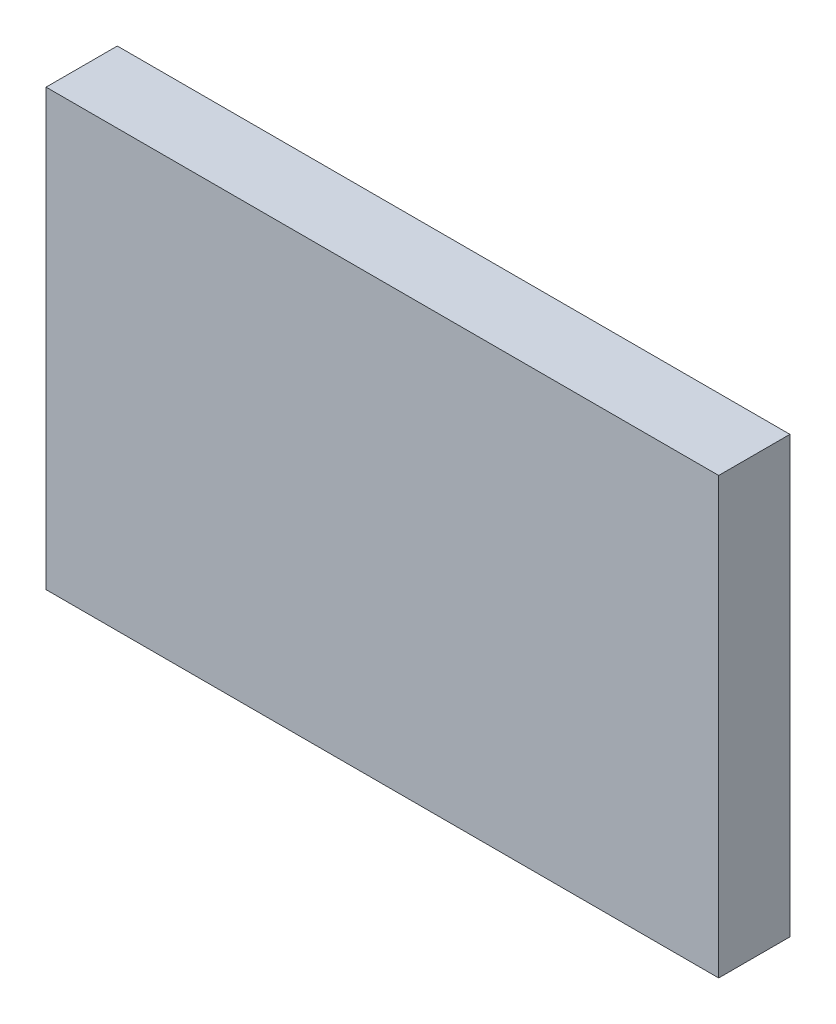
ISO-10303-21;
HEADER;
FILE_DESCRIPTION(('STEP AP214'),'2;1');
FILE_NAME('part.step','',(''),(''),'','','');
FILE_SCHEMA(('AUTOMOTIVE_DESIGN { 1 0 10303 214 1 1 1 1 }'));
ENDSEC;
DATA;
#1=APPLICATION_CONTEXT('core data for automotive mechanical design processes');
#2=APPLICATION_PROTOCOL_DEFINITION('international standard','automotive_design',2000,#1);
#3=PRODUCT_CONTEXT('',#1,'mechanical');
#4=PRODUCT('Part','Part','',(#3));
#5=PRODUCT_RELATED_PRODUCT_CATEGORY('part','',(#4));
#6=PRODUCT_DEFINITION_FORMATION('','',#4);
#7=PRODUCT_DEFINITION_CONTEXT('part definition',#1,'design');
#8=PRODUCT_DEFINITION('design','',#6,#7);
#9=PRODUCT_DEFINITION_SHAPE('','',#8);
#10=(LENGTH_UNIT() NAMED_UNIT(*) SI_UNIT(.MILLI.,.METRE.));
#11=(NAMED_UNIT(*) PLANE_ANGLE_UNIT() SI_UNIT($,.RADIAN.));
#12=(NAMED_UNIT(*) SI_UNIT($,.STERADIAN.) SOLID_ANGLE_UNIT());
#13=UNCERTAINTY_MEASURE_WITH_UNIT(LENGTH_MEASURE(1.E-05),#10,'distance_accuracy_value','');
#14=(GEOMETRIC_REPRESENTATION_CONTEXT(3) GLOBAL_UNCERTAINTY_ASSIGNED_CONTEXT((#13)) GLOBAL_UNIT_ASSIGNED_CONTEXT((#10,
#11,#12)) REPRESENTATION_CONTEXT('',''));
#15=CARTESIAN_POINT('',(0.,0.,0.));
#16=DIRECTION('',(0.,0.,1.));
#17=DIRECTION('',(1.,0.,0.));
#18=AXIS2_PLACEMENT_3D('',#15,#16,#17);
#19=CARTESIAN_POINT('',(-42.5,-27.5,9.));
#20=DIRECTION('',(1.,0.,0.));
#21=DIRECTION('',(0.,0.,-1.));
#22=AXIS2_PLACEMENT_3D('',#19,#20,#21);
#23=PLANE('',#22);
#24=DIRECTION('',(0.,-1.,0.));
#25=VECTOR('',#24,1.);
#26=CARTESIAN_POINT('',(-42.5,-27.5,0.));
#27=LINE('',#26,#25);
#28=CARTESIAN_POINT('',(-42.5,27.5,0.));
#29=VERTEX_POINT('',#28);
#30=CARTESIAN_POINT('',(-42.5,-27.5,0.));
#31=VERTEX_POINT('',#30);
#32=EDGE_CURVE('E96',#29,#31,#27,.T.);
#33=ORIENTED_EDGE('',*,*,#32,.T.);
#34=DIRECTION('',(0.,0.,-1.));
#35=VECTOR('',#34,1.);
#36=CARTESIAN_POINT('',(-42.5,-27.5,9.));
#37=LINE('',#36,#35);
#38=CARTESIAN_POINT('',(-42.5,-27.5,9.));
#39=VERTEX_POINT('',#38);
#40=EDGE_CURVE('E11',#39,#31,#37,.T.);
#41=ORIENTED_EDGE('',*,*,#40,.F.);
#42=DIRECTION('',(0.,-1.,0.));
#43=VECTOR('',#42,1.);
#44=CARTESIAN_POINT('',(-42.5,-27.5,9.));
#45=LINE('',#44,#43);
#46=CARTESIAN_POINT('',(-42.5,27.5,9.));
#47=VERTEX_POINT('',#46);
#48=EDGE_CURVE('E84',#47,#39,#45,.T.);
#49=ORIENTED_EDGE('',*,*,#48,.F.);
#50=DIRECTION('',(0.,0.,-1.));
#51=VECTOR('',#50,1.);
#52=CARTESIAN_POINT('',(-42.5,27.5,9.));
#53=LINE('',#52,#51);
#54=EDGE_CURVE('E92',#47,#29,#53,.T.);
#55=ORIENTED_EDGE('',*,*,#54,.T.);
#56=EDGE_LOOP('',(#33,#41,#49,#55));
#57=FACE_BOUND('',#56,.T.);
#58=ADVANCED_FACE('F33',(#57),#23,.F.);
#59=CARTESIAN_POINT('',(42.5,-27.5,9.));
#60=DIRECTION('',(0.,1.,0.));
#61=DIRECTION('',(-1.,0.,0.));
#62=AXIS2_PLACEMENT_3D('',#59,#60,#61);
#63=PLANE('',#62);
#64=DIRECTION('',(1.,0.,0.));
#65=VECTOR('',#64,1.);
#66=CARTESIAN_POINT('',(42.5,-27.5,0.));
#67=LINE('',#66,#65);
#68=CARTESIAN_POINT('',(42.5,-27.5,0.));
#69=VERTEX_POINT('',#68);
#70=EDGE_CURVE('E88',#31,#69,#67,.T.);
#71=ORIENTED_EDGE('',*,*,#70,.T.);
#72=DIRECTION('',(0.,0.,-1.));
#73=VECTOR('',#72,1.);
#74=CARTESIAN_POINT('',(42.5,-27.5,9.));
#75=LINE('',#74,#73);
#76=CARTESIAN_POINT('',(42.5,-27.5,9.));
#77=VERTEX_POINT('',#76);
#78=EDGE_CURVE('E41',#77,#69,#75,.T.);
#79=ORIENTED_EDGE('',*,*,#78,.F.);
#80=DIRECTION('',(1.,0.,0.));
#81=VECTOR('',#80,1.);
#82=CARTESIAN_POINT('',(42.5,-27.5,9.));
#83=LINE('',#82,#81);
#84=EDGE_CURVE('E79',#39,#77,#83,.T.);
#85=ORIENTED_EDGE('',*,*,#84,.F.);
#86=ORIENTED_EDGE('',*,*,#40,.T.);
#87=EDGE_LOOP('',(#71,#79,#85,#86));
#88=FACE_BOUND('',#87,.T.);
#89=ADVANCED_FACE('F87',(#88),#63,.F.);
#90=CARTESIAN_POINT('',(42.5,-27.5,9.));
#91=DIRECTION('',(-1.,0.,0.));
#92=DIRECTION('',(0.,0.,1.));
#93=AXIS2_PLACEMENT_3D('',#90,#91,#92);
#94=PLANE('',#93);
#95=DIRECTION('',(0.,1.,0.));
#96=VECTOR('',#95,1.);
#97=CARTESIAN_POINT('',(42.5,-27.5,0.));
#98=LINE('',#97,#96);
#99=CARTESIAN_POINT('',(42.5,27.5,0.));
#100=VERTEX_POINT('',#99);
#101=EDGE_CURVE('E66',#69,#100,#98,.T.);
#102=ORIENTED_EDGE('',*,*,#101,.T.);
#103=DIRECTION('',(0.,0.,-1.));
#104=VECTOR('',#103,1.);
#105=CARTESIAN_POINT('',(42.5,27.5,9.));
#106=LINE('',#105,#104);
#107=CARTESIAN_POINT('',(42.5,27.5,9.));
#108=VERTEX_POINT('',#107);
#109=EDGE_CURVE('E89',#108,#100,#106,.T.);
#110=ORIENTED_EDGE('',*,*,#109,.F.);
#111=DIRECTION('',(0.,1.,0.));
#112=VECTOR('',#111,1.);
#113=CARTESIAN_POINT('',(42.5,-27.5,9.));
#114=LINE('',#113,#112);
#115=EDGE_CURVE('E82',#77,#108,#114,.T.);
#116=ORIENTED_EDGE('',*,*,#115,.F.);
#117=ORIENTED_EDGE('',*,*,#78,.T.);
#118=EDGE_LOOP('',(#102,#110,#116,#117));
#119=FACE_BOUND('',#118,.T.);
#120=ADVANCED_FACE('F90',(#119),#94,.F.);
#121=CARTESIAN_POINT('',(42.5,27.5,9.));
#122=DIRECTION('',(0.,-1.,0.));
#123=DIRECTION('',(1.,0.,0.));
#124=AXIS2_PLACEMENT_3D('',#121,#122,#123);
#125=PLANE('',#124);
#126=DIRECTION('',(-1.,0.,0.));
#127=VECTOR('',#126,1.);
#128=CARTESIAN_POINT('',(42.5,27.5,0.));
#129=LINE('',#128,#127);
#130=EDGE_CURVE('E72',#100,#29,#129,.T.);
#131=ORIENTED_EDGE('',*,*,#130,.T.);
#132=ORIENTED_EDGE('',*,*,#54,.F.);
#133=DIRECTION('',(-1.,0.,0.));
#134=VECTOR('',#133,1.);
#135=CARTESIAN_POINT('',(42.5,27.5,9.));
#136=LINE('',#135,#134);
#137=EDGE_CURVE('E49',#108,#47,#136,.T.);
#138=ORIENTED_EDGE('',*,*,#137,.F.);
#139=ORIENTED_EDGE('',*,*,#109,.T.);
#140=EDGE_LOOP('',(#131,#132,#138,#139));
#141=FACE_BOUND('',#140,.T.);
#142=ADVANCED_FACE('F103',(#141),#125,.F.);
#143=CARTESIAN_POINT('',(0.,0.,9.));
#144=DIRECTION('',(0.,0.,1.));
#145=DIRECTION('',(1.,0.,0.));
#146=AXIS2_PLACEMENT_3D('',#143,#144,#145);
#147=PLANE('',#146);
#148=ORIENTED_EDGE('',*,*,#48,.T.);
#149=ORIENTED_EDGE('',*,*,#84,.T.);
#150=ORIENTED_EDGE('',*,*,#115,.T.);
#151=ORIENTED_EDGE('',*,*,#137,.T.);
#152=EDGE_LOOP('',(#148,#149,#150,#151));
#153=FACE_BOUND('',#152,.T.);
#154=ADVANCED_FACE('F80',(#153),#147,.T.);
#155=CARTESIAN_POINT('',(0.,0.,0.));
#156=DIRECTION('',(0.,0.,1.));
#157=DIRECTION('',(1.,0.,0.));
#158=AXIS2_PLACEMENT_3D('',#155,#156,#157);
#159=PLANE('',#158);
#160=ORIENTED_EDGE('',*,*,#32,.F.);
#161=ORIENTED_EDGE('',*,*,#130,.F.);
#162=ORIENTED_EDGE('',*,*,#101,.F.);
#163=ORIENTED_EDGE('',*,*,#70,.F.);
#164=EDGE_LOOP('',(#160,#161,#162,#163));
#165=FACE_BOUND('',#164,.T.);
#166=ADVANCED_FACE('F106',(#165),#159,.F.);
#167=CLOSED_SHELL('',(#58,#89,#120,#142,#154,#166));
#168=MANIFOLD_SOLID_BREP('B2',#167);
#169=ADVANCED_BREP_SHAPE_REPRESENTATION('',(#18,#168),#14);
#170=SHAPE_DEFINITION_REPRESENTATION(#9,#169);
ENDSEC;
END-ISO-10303-21;
